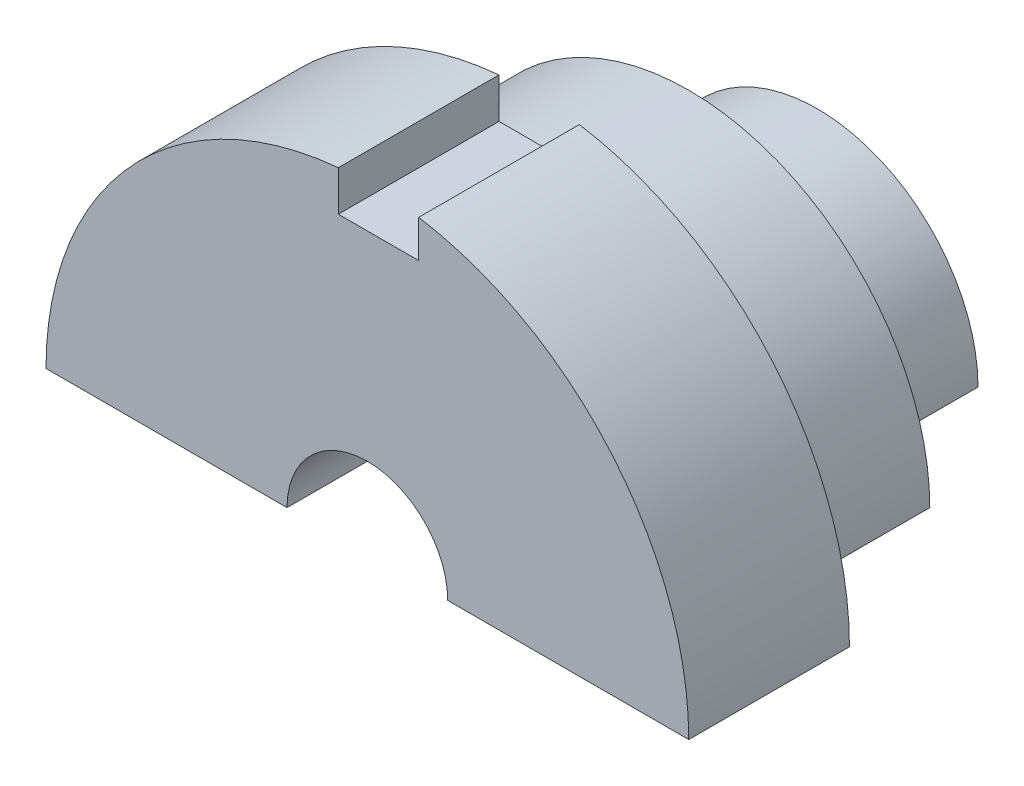
ISO-10303-21;
HEADER;
FILE_DESCRIPTION(('STEP AP214'),'2;1');
FILE_NAME('part.step','',(''),(''),'','','');
FILE_SCHEMA(('AUTOMOTIVE_DESIGN { 1 0 10303 214 1 1 1 1 }'));
ENDSEC;
DATA;
#1=APPLICATION_CONTEXT('core data for automotive mechanical design processes');
#2=APPLICATION_PROTOCOL_DEFINITION('international standard','automotive_design',2000,#1);
#3=PRODUCT_CONTEXT('',#1,'mechanical');
#4=PRODUCT('Part','Part','',(#3));
#5=PRODUCT_RELATED_PRODUCT_CATEGORY('part','',(#4));
#6=PRODUCT_DEFINITION_FORMATION('','',#4);
#7=PRODUCT_DEFINITION_CONTEXT('part definition',#1,'design');
#8=PRODUCT_DEFINITION('design','',#6,#7);
#9=PRODUCT_DEFINITION_SHAPE('','',#8);
#10=(LENGTH_UNIT() NAMED_UNIT(*) SI_UNIT(.MILLI.,.METRE.));
#11=(NAMED_UNIT(*) PLANE_ANGLE_UNIT() SI_UNIT($,.RADIAN.));
#12=(NAMED_UNIT(*) SI_UNIT($,.STERADIAN.) SOLID_ANGLE_UNIT());
#13=UNCERTAINTY_MEASURE_WITH_UNIT(LENGTH_MEASURE(1.E-05),#10,'distance_accuracy_value','');
#14=(GEOMETRIC_REPRESENTATION_CONTEXT(3) GLOBAL_UNCERTAINTY_ASSIGNED_CONTEXT((#13)) GLOBAL_UNIT_ASSIGNED_CONTEXT((#10,
#11,#12)) REPRESENTATION_CONTEXT('',''));
#15=CARTESIAN_POINT('',(0.,0.,0.));
#16=DIRECTION('',(0.,0.,1.));
#17=DIRECTION('',(1.,0.,0.));
#18=AXIS2_PLACEMENT_3D('',#15,#16,#17);
#19=CARTESIAN_POINT('',(0.,0.,10.));
#20=DIRECTION('',(0.,1.,0.));
#21=DIRECTION('',(0.,0.,1.));
#22=AXIS2_PLACEMENT_3D('',#19,#20,#21);
#23=PLANE('',#22);
#24=DIRECTION('',(1.,0.,0.));
#25=VECTOR('',#24,1.);
#26=CARTESIAN_POINT('',(0.,0.,10.));
#27=LINE('',#26,#25);
#28=CARTESIAN_POINT('',(25.,0.,10.));
#29=VERTEX_POINT('',#28);
#30=CARTESIAN_POINT('',(40.,0.,10.));
#31=VERTEX_POINT('',#30);
#32=EDGE_CURVE('E134',#29,#31,#27,.T.);
#33=ORIENTED_EDGE('',*,*,#32,.F.);
#34=DIRECTION('',(0.,0.,-1.));
#35=VECTOR('',#34,1.);
#36=CARTESIAN_POINT('',(25.,0.,23.));
#37=LINE('',#36,#35);
#38=CARTESIAN_POINT('',(25.,0.,-18.));
#39=VERTEX_POINT('',#38);
#40=EDGE_CURVE('E122',#29,#39,#37,.T.);
#41=ORIENTED_EDGE('',*,*,#40,.T.);
#42=DIRECTION('',(-1.,0.,0.));
#43=VECTOR('',#42,1.);
#44=CARTESIAN_POINT('',(30.,0.,-18.));
#45=LINE('',#44,#43);
#46=CARTESIAN_POINT('',(30.,0.,-18.));
#47=VERTEX_POINT('',#46);
#48=EDGE_CURVE('E131',#47,#39,#45,.T.);
#49=ORIENTED_EDGE('',*,*,#48,.F.);
#50=DIRECTION('',(0.,0.,1.));
#51=VECTOR('',#50,1.);
#52=CARTESIAN_POINT('',(30.,0.,-18.));
#53=LINE('',#52,#51);
#54=CARTESIAN_POINT('',(30.,0.,-10.));
#55=VERTEX_POINT('',#54);
#56=EDGE_CURVE('E144',#47,#55,#53,.T.);
#57=ORIENTED_EDGE('',*,*,#56,.T.);
#58=DIRECTION('',(-1.,0.,0.));
#59=VECTOR('',#58,1.);
#60=CARTESIAN_POINT('',(35.,0.,-10.));
#61=LINE('',#60,#59);
#62=CARTESIAN_POINT('',(35.,0.,-10.));
#63=VERTEX_POINT('',#62);
#64=EDGE_CURVE('E157',#63,#55,#61,.T.);
#65=ORIENTED_EDGE('',*,*,#64,.F.);
#66=DIRECTION('',(0.,0.,1.));
#67=VECTOR('',#66,1.);
#68=CARTESIAN_POINT('',(35.,0.,-10.));
#69=LINE('',#68,#67);
#70=CARTESIAN_POINT('',(35.,0.,0.));
#71=VERTEX_POINT('',#70);
#72=EDGE_CURVE('E164',#63,#71,#69,.T.);
#73=ORIENTED_EDGE('',*,*,#72,.T.);
#74=DIRECTION('',(1.,0.,0.));
#75=VECTOR('',#74,1.);
#76=CARTESIAN_POINT('',(0.,0.,0.));
#77=LINE('',#76,#75);
#78=CARTESIAN_POINT('',(40.,0.,0.));
#79=VERTEX_POINT('',#78);
#80=EDGE_CURVE('E194',#71,#79,#77,.T.);
#81=ORIENTED_EDGE('',*,*,#80,.T.);
#82=DIRECTION('',(0.,0.,-1.));
#83=VECTOR('',#82,1.);
#84=CARTESIAN_POINT('',(40.,0.,10.));
#85=LINE('',#84,#83);
#86=EDGE_CURVE('E190',#31,#79,#85,.T.);
#87=ORIENTED_EDGE('',*,*,#86,.F.);
#88=EDGE_LOOP('',(#33,#41,#49,#57,#65,#73,#81,#87));
#89=FACE_BOUND('',#88,.T.);
#90=ADVANCED_FACE('F33',(#89),#23,.F.);
#91=CARTESIAN_POINT('',(20.,0.,10.));
#92=DIRECTION('',(0.,0.,-1.));
#93=DIRECTION('',(-1.,0.,0.));
#94=AXIS2_PLACEMENT_3D('',#91,#92,#93);
#95=CYLINDRICAL_SURFACE('',#94,20.);
#96=DIRECTION('',(0.,0.,-1.));
#97=VECTOR('',#96,1.);
#98=CARTESIAN_POINT('',(23.1928496778703,19.7434979407025,10.));
#99=LINE('',#98,#97);
#100=CARTESIAN_POINT('',(23.1928496778703,19.7434979407025,10.));
#101=VERTEX_POINT('',#100);
#102=CARTESIAN_POINT('',(23.1928496778703,19.7434979407025,0.));
#103=VERTEX_POINT('',#102);
#104=EDGE_CURVE('E178',#101,#103,#99,.T.);
#105=ORIENTED_EDGE('',*,*,#104,.F.);
#106=CARTESIAN_POINT('',(20.,0.,10.));
#107=DIRECTION('',(0.,0.,1.));
#108=DIRECTION('',(-1.,0.,0.));
#109=AXIS2_PLACEMENT_3D('',#106,#107,#108);
#110=CIRCLE('',#109,20.);
#111=EDGE_CURVE('E183',#31,#101,#110,.T.);
#112=ORIENTED_EDGE('',*,*,#111,.F.);
#113=ORIENTED_EDGE('',*,*,#86,.T.);
#114=CARTESIAN_POINT('',(20.,0.,0.));
#115=DIRECTION('',(0.,0.,1.));
#116=DIRECTION('',(-1.,0.,0.));
#117=AXIS2_PLACEMENT_3D('',#114,#115,#116);
#118=CIRCLE('',#117,20.);
#119=EDGE_CURVE('E191',#79,#103,#118,.T.);
#120=ORIENTED_EDGE('',*,*,#119,.T.);
#121=EDGE_LOOP('',(#105,#112,#113,#120));
#122=FACE_BOUND('',#121,.T.);
#123=ADVANCED_FACE('F35',(#122),#95,.T.);
#124=DIRECTION('',(0.,0.,-1.));
#125=VECTOR('',#124,1.);
#126=CARTESIAN_POINT('',(18.1928496778703,19.9181878621833,10.));
#127=LINE('',#126,#125);
#128=CARTESIAN_POINT('',(18.1928496778703,19.9181878621833,0.));
#129=VERTEX_POINT('',#128);
#130=CARTESIAN_POINT('',(18.1928496778703,19.9181878621833,10.));
#131=VERTEX_POINT('',#130);
#132=EDGE_CURVE('E174',#129,#131,#127,.F.);
#133=ORIENTED_EDGE('',*,*,#132,.F.);
#134=CARTESIAN_POINT('',(0.,0.,0.));
#135=VERTEX_POINT('',#134);
#136=EDGE_CURVE('E182',#129,#135,#118,.T.);
#137=ORIENTED_EDGE('',*,*,#136,.T.);
#138=DIRECTION('',(0.,0.,-1.));
#139=VECTOR('',#138,1.);
#140=CARTESIAN_POINT('',(0.,0.,10.));
#141=LINE('',#140,#139);
#142=CARTESIAN_POINT('',(0.,0.,10.));
#143=VERTEX_POINT('',#142);
#144=EDGE_CURVE('E200',#143,#135,#141,.T.);
#145=ORIENTED_EDGE('',*,*,#144,.F.);
#146=EDGE_CURVE('E186',#131,#143,#110,.T.);
#147=ORIENTED_EDGE('',*,*,#146,.F.);
#148=EDGE_LOOP('',(#133,#137,#145,#147));
#149=FACE_BOUND('',#148,.T.);
#150=ADVANCED_FACE('F217',(#149),#95,.T.);
#151=CARTESIAN_POINT('',(20.,0.,10.));
#152=DIRECTION('',(0.,0.,-1.));
#153=DIRECTION('',(-1.,0.,0.));
#154=AXIS2_PLACEMENT_3D('',#151,#152,#153);
#155=PLANE('',#154);
#156=CARTESIAN_POINT('',(15.,0.,10.));
#157=VERTEX_POINT('',#156);
#158=EDGE_CURVE('E187',#143,#157,#27,.T.);
#159=ORIENTED_EDGE('',*,*,#158,.T.);
#160=CARTESIAN_POINT('',(20.,0.,10.));
#161=DIRECTION('',(0.,0.,-1.));
#162=DIRECTION('',(-1.,0.,0.));
#163=AXIS2_PLACEMENT_3D('',#160,#161,#162);
#164=CIRCLE('',#163,5.);
#165=EDGE_CURVE('E149',#157,#29,#164,.T.);
#166=ORIENTED_EDGE('',*,*,#165,.T.);
#167=ORIENTED_EDGE('',*,*,#32,.T.);
#168=ORIENTED_EDGE('',*,*,#111,.T.);
#169=DIRECTION('',(0.,1.,0.));
#170=VECTOR('',#169,1.);
#171=CARTESIAN_POINT('',(23.1928496778704,0.,10.));
#172=LINE('',#171,#170);
#173=CARTESIAN_POINT('',(23.1928496778703,17.4123792873793,10.));
#174=VERTEX_POINT('',#173);
#175=EDGE_CURVE('E180',#174,#101,#172,.T.);
#176=ORIENTED_EDGE('',*,*,#175,.F.);
#177=DIRECTION('',(1.,0.,0.));
#178=VECTOR('',#177,1.);
#179=CARTESIAN_POINT('',(20.,17.4123792873793,10.));
#180=LINE('',#179,#178);
#181=CARTESIAN_POINT('',(18.1928496778703,17.4123792873793,10.));
#182=VERTEX_POINT('',#181);
#183=EDGE_CURVE('E172',#182,#174,#180,.T.);
#184=ORIENTED_EDGE('',*,*,#183,.F.);
#185=DIRECTION('',(0.,-1.,0.));
#186=VECTOR('',#185,1.);
#187=CARTESIAN_POINT('',(18.1928496778703,0.,10.));
#188=LINE('',#187,#186);
#189=EDGE_CURVE('E176',#131,#182,#188,.T.);
#190=ORIENTED_EDGE('',*,*,#189,.F.);
#191=ORIENTED_EDGE('',*,*,#146,.T.);
#192=EDGE_LOOP('',(#159,#166,#167,#168,#176,#184,#190,#191));
#193=FACE_BOUND('',#192,.T.);
#194=ADVANCED_FACE('F221',(#193),#155,.F.);
#195=CARTESIAN_POINT('',(20.,0.,0.));
#196=DIRECTION('',(0.,0.,-1.));
#197=DIRECTION('',(-1.,0.,0.));
#198=AXIS2_PLACEMENT_3D('',#195,#196,#197);
#199=PLANE('',#198);
#200=CARTESIAN_POINT('',(20.,0.,0.));
#201=DIRECTION('',(0.,0.,-1.));
#202=DIRECTION('',(1.,0.,0.));
#203=AXIS2_PLACEMENT_3D('',#200,#201,#202);
#204=CIRCLE('',#203,15.);
#205=CARTESIAN_POINT('',(5.,0.,0.));
#206=VERTEX_POINT('',#205);
#207=EDGE_CURVE('E152',#206,#71,#204,.T.);
#208=ORIENTED_EDGE('',*,*,#207,.F.);
#209=EDGE_CURVE('E195',#135,#206,#77,.T.);
#210=ORIENTED_EDGE('',*,*,#209,.F.);
#211=ORIENTED_EDGE('',*,*,#136,.F.);
#212=DIRECTION('',(0.,-1.,0.));
#213=VECTOR('',#212,1.);
#214=CARTESIAN_POINT('',(18.1928496778703,0.,0.));
#215=LINE('',#214,#213);
#216=CARTESIAN_POINT('',(18.1928496778703,17.4123792873793,0.));
#217=VERTEX_POINT('',#216);
#218=EDGE_CURVE('E41',#129,#217,#215,.T.);
#219=ORIENTED_EDGE('',*,*,#218,.T.);
#220=DIRECTION('',(1.,0.,0.));
#221=VECTOR('',#220,1.);
#222=CARTESIAN_POINT('',(20.,17.4123792873793,0.));
#223=LINE('',#222,#221);
#224=CARTESIAN_POINT('',(23.1928496778703,17.4123792873793,0.));
#225=VERTEX_POINT('',#224);
#226=EDGE_CURVE('E203',#217,#225,#223,.T.);
#227=ORIENTED_EDGE('',*,*,#226,.T.);
#228=DIRECTION('',(0.,1.,0.));
#229=VECTOR('',#228,1.);
#230=CARTESIAN_POINT('',(23.1928496778704,0.,0.));
#231=LINE('',#230,#229);
#232=EDGE_CURVE('E11',#225,#103,#231,.T.);
#233=ORIENTED_EDGE('',*,*,#232,.T.);
#234=ORIENTED_EDGE('',*,*,#119,.F.);
#235=ORIENTED_EDGE('',*,*,#80,.F.);
#236=EDGE_LOOP('',(#208,#210,#211,#219,#227,#233,#234,#235));
#237=FACE_BOUND('',#236,.T.);
#238=ADVANCED_FACE('F208',(#237),#199,.T.);
#239=CARTESIAN_POINT('',(15.,0.,-18.));
#240=VERTEX_POINT('',#239);
#241=CARTESIAN_POINT('',(10.,0.,-18.));
#242=VERTEX_POINT('',#241);
#243=EDGE_CURVE('E141',#240,#242,#45,.T.);
#244=ORIENTED_EDGE('',*,*,#243,.F.);
#245=DIRECTION('',(0.,0.,-1.));
#246=VECTOR('',#245,1.);
#247=CARTESIAN_POINT('',(15.,0.,23.));
#248=LINE('',#247,#246);
#249=EDGE_CURVE('E48',#157,#240,#248,.T.);
#250=ORIENTED_EDGE('',*,*,#249,.F.);
#251=ORIENTED_EDGE('',*,*,#158,.F.);
#252=ORIENTED_EDGE('',*,*,#144,.T.);
#253=ORIENTED_EDGE('',*,*,#209,.T.);
#254=DIRECTION('',(0.,0.,1.));
#255=VECTOR('',#254,1.);
#256=CARTESIAN_POINT('',(5.,0.,-10.));
#257=LINE('',#256,#255);
#258=CARTESIAN_POINT('',(5.,0.,-10.));
#259=VERTEX_POINT('',#258);
#260=EDGE_CURVE('E159',#259,#206,#257,.T.);
#261=ORIENTED_EDGE('',*,*,#260,.F.);
#262=CARTESIAN_POINT('',(10.,0.,-10.));
#263=VERTEX_POINT('',#262);
#264=EDGE_CURVE('E156',#263,#259,#61,.T.);
#265=ORIENTED_EDGE('',*,*,#264,.F.);
#266=DIRECTION('',(0.,0.,1.));
#267=VECTOR('',#266,1.);
#268=CARTESIAN_POINT('',(10.,0.,-18.));
#269=LINE('',#268,#267);
#270=EDGE_CURVE('E140',#242,#263,#269,.T.);
#271=ORIENTED_EDGE('',*,*,#270,.F.);
#272=EDGE_LOOP('',(#244,#250,#251,#252,#253,#261,#265,#271));
#273=FACE_BOUND('',#272,.T.);
#274=ADVANCED_FACE('F224',(#273),#23,.F.);
#275=CARTESIAN_POINT('',(23.1928496778703,21.9455699259419,22.));
#276=DIRECTION('',(-1.,0.,0.));
#277=DIRECTION('',(0.,-1.,0.));
#278=AXIS2_PLACEMENT_3D('',#275,#276,#277);
#279=PLANE('',#278);
#280=ORIENTED_EDGE('',*,*,#175,.T.);
#281=ORIENTED_EDGE('',*,*,#104,.T.);
#282=ORIENTED_EDGE('',*,*,#232,.F.);
#283=DIRECTION('',(0.,0.,-1.));
#284=VECTOR('',#283,1.);
#285=CARTESIAN_POINT('',(23.1928496778703,17.4123792873793,22.));
#286=LINE('',#285,#284);
#287=EDGE_CURVE('E167',#174,#225,#286,.T.);
#288=ORIENTED_EDGE('',*,*,#287,.F.);
#289=EDGE_LOOP('',(#280,#281,#282,#288));
#290=FACE_BOUND('',#289,.T.);
#291=ADVANCED_FACE('F234',(#290),#279,.T.);
#292=CARTESIAN_POINT('',(18.1928496778703,21.9455699259419,22.));
#293=DIRECTION('',(1.,0.,0.));
#294=DIRECTION('',(0.,0.,-1.));
#295=AXIS2_PLACEMENT_3D('',#292,#293,#294);
#296=PLANE('',#295);
#297=ORIENTED_EDGE('',*,*,#189,.T.);
#298=DIRECTION('',(0.,0.,-1.));
#299=VECTOR('',#298,1.);
#300=CARTESIAN_POINT('',(18.1928496778703,17.4123792873793,22.));
#301=LINE('',#300,#299);
#302=EDGE_CURVE('E169',#182,#217,#301,.T.);
#303=ORIENTED_EDGE('',*,*,#302,.T.);
#304=ORIENTED_EDGE('',*,*,#218,.F.);
#305=ORIENTED_EDGE('',*,*,#132,.T.);
#306=EDGE_LOOP('',(#297,#303,#304,#305));
#307=FACE_BOUND('',#306,.T.);
#308=ADVANCED_FACE('F212',(#307),#296,.T.);
#309=CARTESIAN_POINT('',(23.1928496778703,17.4123792873793,22.));
#310=DIRECTION('',(0.,1.,0.));
#311=DIRECTION('',(-1.,0.,0.));
#312=AXIS2_PLACEMENT_3D('',#309,#310,#311);
#313=PLANE('',#312);
#314=ORIENTED_EDGE('',*,*,#183,.T.);
#315=ORIENTED_EDGE('',*,*,#287,.T.);
#316=ORIENTED_EDGE('',*,*,#226,.F.);
#317=ORIENTED_EDGE('',*,*,#302,.F.);
#318=EDGE_LOOP('',(#314,#315,#316,#317));
#319=FACE_BOUND('',#318,.T.);
#320=ADVANCED_FACE('F270',(#319),#313,.T.);
#321=CARTESIAN_POINT('',(20.,0.,-10.));
#322=DIRECTION('',(0.,0.,1.));
#323=DIRECTION('',(1.,0.,0.));
#324=AXIS2_PLACEMENT_3D('',#321,#322,#323);
#325=CYLINDRICAL_SURFACE('',#324,15.);
#326=ORIENTED_EDGE('',*,*,#207,.T.);
#327=ORIENTED_EDGE('',*,*,#72,.F.);
#328=CARTESIAN_POINT('',(20.,0.,-10.));
#329=DIRECTION('',(0.,0.,-1.));
#330=DIRECTION('',(1.,0.,0.));
#331=AXIS2_PLACEMENT_3D('',#328,#329,#330);
#332=CIRCLE('',#331,15.);
#333=EDGE_CURVE('E153',#259,#63,#332,.T.);
#334=ORIENTED_EDGE('',*,*,#333,.F.);
#335=ORIENTED_EDGE('',*,*,#260,.T.);
#336=EDGE_LOOP('',(#326,#327,#334,#335));
#337=FACE_BOUND('',#336,.T.);
#338=ADVANCED_FACE('F239',(#337),#325,.T.);
#339=CARTESIAN_POINT('',(20.,0.,-10.));
#340=DIRECTION('',(0.,0.,1.));
#341=DIRECTION('',(1.,0.,0.));
#342=AXIS2_PLACEMENT_3D('',#339,#340,#341);
#343=PLANE('',#342);
#344=CARTESIAN_POINT('',(20.,0.,-10.));
#345=DIRECTION('',(0.,0.,-1.));
#346=DIRECTION('',(1.,0.,0.));
#347=AXIS2_PLACEMENT_3D('',#344,#345,#346);
#348=CIRCLE('',#347,10.);
#349=EDGE_CURVE('E56',#263,#55,#348,.T.);
#350=ORIENTED_EDGE('',*,*,#349,.F.);
#351=ORIENTED_EDGE('',*,*,#264,.T.);
#352=ORIENTED_EDGE('',*,*,#333,.T.);
#353=ORIENTED_EDGE('',*,*,#64,.T.);
#354=EDGE_LOOP('',(#350,#351,#352,#353));
#355=FACE_BOUND('',#354,.T.);
#356=ADVANCED_FACE('F244',(#355),#343,.F.);
#357=CARTESIAN_POINT('',(20.,0.,-18.));
#358=DIRECTION('',(0.,0.,1.));
#359=DIRECTION('',(1.,0.,0.));
#360=AXIS2_PLACEMENT_3D('',#357,#358,#359);
#361=CYLINDRICAL_SURFACE('',#360,10.);
#362=ORIENTED_EDGE('',*,*,#349,.T.);
#363=ORIENTED_EDGE('',*,*,#56,.F.);
#364=CARTESIAN_POINT('',(20.,0.,-18.));
#365=DIRECTION('',(0.,0.,-1.));
#366=DIRECTION('',(1.,0.,0.));
#367=AXIS2_PLACEMENT_3D('',#364,#365,#366);
#368=CIRCLE('',#367,10.);
#369=EDGE_CURVE('E138',#242,#47,#368,.T.);
#370=ORIENTED_EDGE('',*,*,#369,.F.);
#371=ORIENTED_EDGE('',*,*,#270,.T.);
#372=EDGE_LOOP('',(#362,#363,#370,#371));
#373=FACE_BOUND('',#372,.T.);
#374=ADVANCED_FACE('F242',(#373),#361,.T.);
#375=CARTESIAN_POINT('',(20.,0.,-18.));
#376=DIRECTION('',(0.,0.,1.));
#377=DIRECTION('',(1.,0.,0.));
#378=AXIS2_PLACEMENT_3D('',#375,#376,#377);
#379=PLANE('',#378);
#380=ORIENTED_EDGE('',*,*,#48,.T.);
#381=CARTESIAN_POINT('',(20.,0.,-18.));
#382=DIRECTION('',(0.,0.,-1.));
#383=DIRECTION('',(1.,0.,0.));
#384=AXIS2_PLACEMENT_3D('',#381,#382,#383);
#385=CIRCLE('',#384,5.);
#386=EDGE_CURVE('E119',#240,#39,#385,.T.);
#387=ORIENTED_EDGE('',*,*,#386,.F.);
#388=ORIENTED_EDGE('',*,*,#243,.T.);
#389=ORIENTED_EDGE('',*,*,#369,.T.);
#390=EDGE_LOOP('',(#380,#387,#388,#389));
#391=FACE_BOUND('',#390,.T.);
#392=ADVANCED_FACE('F136',(#391),#379,.F.);
#393=CARTESIAN_POINT('',(20.,0.,23.));
#394=DIRECTION('',(0.,0.,-1.));
#395=DIRECTION('',(-1.,0.,0.));
#396=AXIS2_PLACEMENT_3D('',#393,#394,#395);
#397=CYLINDRICAL_SURFACE('',#396,5.);
#398=ORIENTED_EDGE('',*,*,#249,.T.);
#399=ORIENTED_EDGE('',*,*,#386,.T.);
#400=ORIENTED_EDGE('',*,*,#40,.F.);
#401=ORIENTED_EDGE('',*,*,#165,.F.);
#402=EDGE_LOOP('',(#398,#399,#400,#401));
#403=FACE_BOUND('',#402,.T.);
#404=ADVANCED_FACE('F121',(#403),#397,.F.);
#405=CLOSED_SHELL('',(#90,#123,#150,#194,#238,#274,#291,#308,#320,#338,#356,#374,#392,#404));
#406=MANIFOLD_SOLID_BREP('B2',#405);
#407=ADVANCED_BREP_SHAPE_REPRESENTATION('',(#18,#406),#14);
#408=SHAPE_DEFINITION_REPRESENTATION(#9,#407);
ENDSEC;
END-ISO-10303-21;
